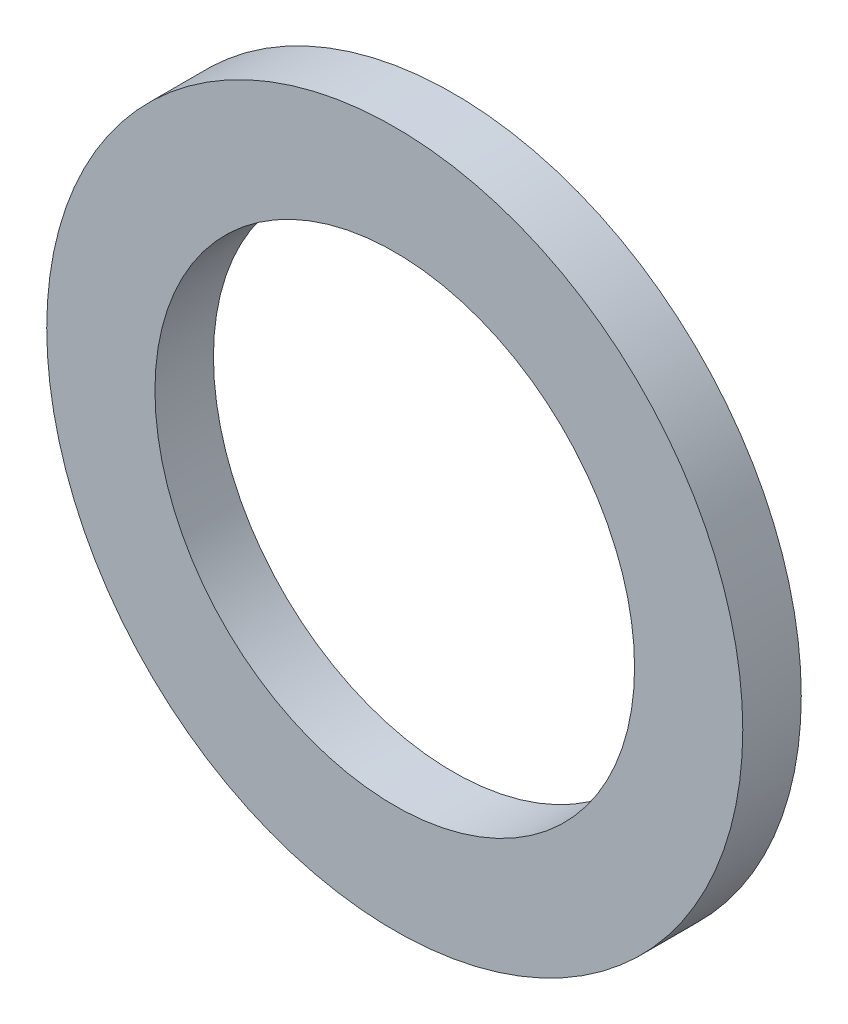
ISO-10303-21;
HEADER;
FILE_DESCRIPTION(('STEP AP214'),'2;1');
FILE_NAME('part.step','',(''),(''),'','','');
FILE_SCHEMA(('AUTOMOTIVE_DESIGN { 1 0 10303 214 1 1 1 1 }'));
ENDSEC;
DATA;
#1=APPLICATION_CONTEXT('core data for automotive mechanical design processes');
#2=APPLICATION_PROTOCOL_DEFINITION('international standard','automotive_design',2000,#1);
#3=PRODUCT_CONTEXT('',#1,'mechanical');
#4=PRODUCT('Part','Part','',(#3));
#5=PRODUCT_RELATED_PRODUCT_CATEGORY('part','',(#4));
#6=PRODUCT_DEFINITION_FORMATION('','',#4);
#7=PRODUCT_DEFINITION_CONTEXT('part definition',#1,'design');
#8=PRODUCT_DEFINITION('design','',#6,#7);
#9=PRODUCT_DEFINITION_SHAPE('','',#8);
#10=(LENGTH_UNIT() NAMED_UNIT(*) SI_UNIT(.MILLI.,.METRE.));
#11=(NAMED_UNIT(*) PLANE_ANGLE_UNIT() SI_UNIT($,.RADIAN.));
#12=(NAMED_UNIT(*) SI_UNIT($,.STERADIAN.) SOLID_ANGLE_UNIT());
#13=UNCERTAINTY_MEASURE_WITH_UNIT(LENGTH_MEASURE(1.E-05),#10,'distance_accuracy_value','');
#14=(GEOMETRIC_REPRESENTATION_CONTEXT(3) GLOBAL_UNCERTAINTY_ASSIGNED_CONTEXT((#13)) GLOBAL_UNIT_ASSIGNED_CONTEXT((#10,
#11,#12)) REPRESENTATION_CONTEXT('',''));
#15=CARTESIAN_POINT('',(0.,0.,0.));
#16=DIRECTION('',(0.,0.,1.));
#17=DIRECTION('',(1.,0.,0.));
#18=AXIS2_PLACEMENT_3D('',#15,#16,#17);
#19=CARTESIAN_POINT('',(0.,0.,0.5));
#20=DIRECTION('',(0.,0.,1.));
#21=DIRECTION('',(1.,0.,0.));
#22=AXIS2_PLACEMENT_3D('',#19,#20,#21);
#23=PLANE('',#22);
#24=CARTESIAN_POINT('',(0.,0.,0.5));
#25=DIRECTION('',(0.,0.,1.));
#26=DIRECTION('',(1.,0.,0.));
#27=AXIS2_PLACEMENT_3D('',#24,#25,#26);
#28=CIRCLE('',#27,5.95);
#29=CARTESIAN_POINT('',(5.95,0.,0.5));
#30=VERTEX_POINT('',#29);
#31=EDGE_CURVE('E10',#30,#30,#28,.T.);
#32=ORIENTED_EDGE('',*,*,#31,.T.);
#33=EDGE_LOOP('',(#32));
#34=FACE_BOUND('',#33,.T.);
#35=CARTESIAN_POINT('',(0.,0.,0.5));
#36=DIRECTION('',(0.,0.,1.));
#37=DIRECTION('',(1.,0.,0.));
#38=AXIS2_PLACEMENT_3D('',#35,#36,#37);
#39=CIRCLE('',#38,4.1);
#40=CARTESIAN_POINT('',(4.1,0.,0.5));
#41=VERTEX_POINT('',#40);
#42=EDGE_CURVE('E48',#41,#41,#39,.T.);
#43=ORIENTED_EDGE('',*,*,#42,.F.);
#44=EDGE_LOOP('',(#43));
#45=FACE_BOUND('',#44,.T.);
#46=ADVANCED_FACE('F34',(#34,#45),#23,.T.);
#47=CARTESIAN_POINT('',(0.,0.,-0.5));
#48=DIRECTION('',(0.,0.,1.));
#49=DIRECTION('',(1.,0.,0.));
#50=AXIS2_PLACEMENT_3D('',#47,#48,#49);
#51=PLANE('',#50);
#52=CARTESIAN_POINT('',(0.,0.,-0.5));
#53=DIRECTION('',(0.,0.,1.));
#54=DIRECTION('',(1.,0.,0.));
#55=AXIS2_PLACEMENT_3D('',#52,#53,#54);
#56=CIRCLE('',#55,5.95);
#57=CARTESIAN_POINT('',(5.95,0.,-0.5));
#58=VERTEX_POINT('',#57);
#59=EDGE_CURVE('E38',#58,#58,#56,.T.);
#60=ORIENTED_EDGE('',*,*,#59,.F.);
#61=EDGE_LOOP('',(#60));
#62=FACE_BOUND('',#61,.T.);
#63=CARTESIAN_POINT('',(0.,0.,-0.5));
#64=DIRECTION('',(0.,0.,1.));
#65=DIRECTION('',(1.,0.,0.));
#66=AXIS2_PLACEMENT_3D('',#63,#64,#65);
#67=CIRCLE('',#66,4.1);
#68=CARTESIAN_POINT('',(4.1,0.,-0.5));
#69=VERTEX_POINT('',#68);
#70=EDGE_CURVE('E50',#69,#69,#67,.T.);
#71=ORIENTED_EDGE('',*,*,#70,.T.);
#72=EDGE_LOOP('',(#71));
#73=FACE_BOUND('',#72,.T.);
#74=ADVANCED_FACE('F61',(#62,#73),#51,.F.);
#75=CARTESIAN_POINT('',(0.,0.,0.5));
#76=DIRECTION('',(0.,0.,-1.));
#77=DIRECTION('',(-1.,0.,0.));
#78=AXIS2_PLACEMENT_3D('',#75,#76,#77);
#79=CYLINDRICAL_SURFACE('',#78,5.95);
#80=ORIENTED_EDGE('',*,*,#31,.F.);
#81=EDGE_LOOP('',(#80));
#82=FACE_BOUND('',#81,.T.);
#83=ORIENTED_EDGE('',*,*,#59,.T.);
#84=EDGE_LOOP('',(#83));
#85=FACE_BOUND('',#84,.T.);
#86=ADVANCED_FACE('F36',(#82,#85),#79,.T.);
#87=CARTESIAN_POINT('',(0.,0.,0.5));
#88=DIRECTION('',(0.,0.,-1.));
#89=DIRECTION('',(-1.,0.,0.));
#90=AXIS2_PLACEMENT_3D('',#87,#88,#89);
#91=CYLINDRICAL_SURFACE('',#90,4.1);
#92=ORIENTED_EDGE('',*,*,#42,.T.);
#93=EDGE_LOOP('',(#92));
#94=FACE_BOUND('',#93,.T.);
#95=ORIENTED_EDGE('',*,*,#70,.F.);
#96=EDGE_LOOP('',(#95));
#97=FACE_BOUND('',#96,.T.);
#98=ADVANCED_FACE('F57',(#94,#97),#91,.F.);
#99=CLOSED_SHELL('',(#46,#74,#86,#98));
#100=MANIFOLD_SOLID_BREP('B2',#99);
#101=ADVANCED_BREP_SHAPE_REPRESENTATION('',(#18,#100),#14);
#102=SHAPE_DEFINITION_REPRESENTATION(#9,#101);
ENDSEC;
END-ISO-10303-21;
